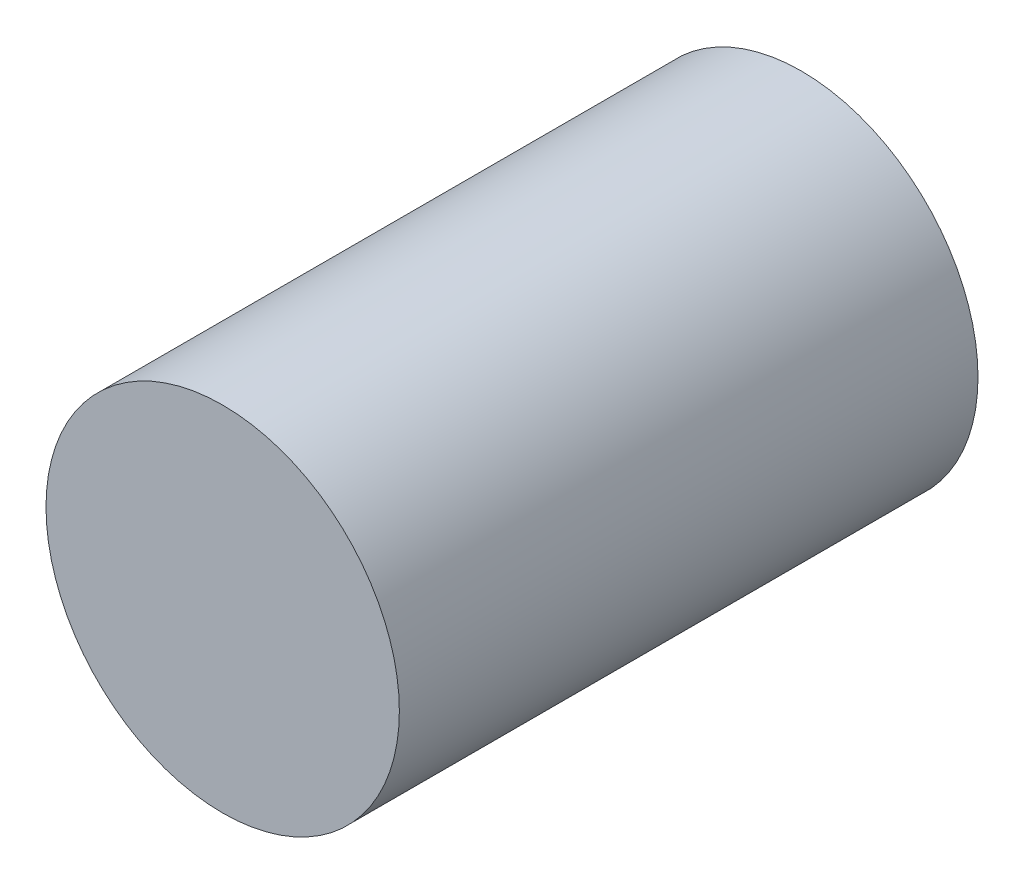
ISO-10303-21;
HEADER;
FILE_DESCRIPTION(('STEP AP214'),'2;1');
FILE_NAME('part.step','',(''),(''),'','','');
FILE_SCHEMA(('AUTOMOTIVE_DESIGN { 1 0 10303 214 1 1 1 1 }'));
ENDSEC;
DATA;
#1=APPLICATION_CONTEXT('core data for automotive mechanical design processes');
#2=APPLICATION_PROTOCOL_DEFINITION('international standard','automotive_design',2000,#1);
#3=PRODUCT_CONTEXT('',#1,'mechanical');
#4=PRODUCT('Part','Part','',(#3));
#5=PRODUCT_RELATED_PRODUCT_CATEGORY('part','',(#4));
#6=PRODUCT_DEFINITION_FORMATION('','',#4);
#7=PRODUCT_DEFINITION_CONTEXT('part definition',#1,'design');
#8=PRODUCT_DEFINITION('design','',#6,#7);
#9=PRODUCT_DEFINITION_SHAPE('','',#8);
#10=(LENGTH_UNIT() NAMED_UNIT(*) SI_UNIT(.MILLI.,.METRE.));
#11=(NAMED_UNIT(*) PLANE_ANGLE_UNIT() SI_UNIT($,.RADIAN.));
#12=(NAMED_UNIT(*) SI_UNIT($,.STERADIAN.) SOLID_ANGLE_UNIT());
#13=UNCERTAINTY_MEASURE_WITH_UNIT(LENGTH_MEASURE(1.E-05),#10,'distance_accuracy_value','');
#14=(GEOMETRIC_REPRESENTATION_CONTEXT(3) GLOBAL_UNCERTAINTY_ASSIGNED_CONTEXT((#13)) GLOBAL_UNIT_ASSIGNED_CONTEXT((#10,
#11,#12)) REPRESENTATION_CONTEXT('',''));
#15=CARTESIAN_POINT('',(0.,0.,0.));
#16=DIRECTION('',(0.,0.,1.));
#17=DIRECTION('',(1.,0.,0.));
#18=AXIS2_PLACEMENT_3D('',#15,#16,#17);
#19=CARTESIAN_POINT('',(0.,0.,0.));
#20=DIRECTION('',(0.,0.,1.));
#21=DIRECTION('',(1.,0.,0.));
#22=AXIS2_PLACEMENT_3D('',#19,#20,#21);
#23=PLANE('',#22);
#24=CARTESIAN_POINT('',(0.,0.,0.));
#25=DIRECTION('',(0.,0.,1.));
#26=DIRECTION('',(1.,0.,0.));
#27=AXIS2_PLACEMENT_3D('',#24,#25,#26);
#28=CIRCLE('',#27,4.);
#29=CARTESIAN_POINT('',(4.,0.,0.));
#30=VERTEX_POINT('',#29);
#31=EDGE_CURVE('E9',#30,#30,#28,.T.);
#32=ORIENTED_EDGE('',*,*,#31,.F.);
#33=EDGE_LOOP('',(#32));
#34=FACE_BOUND('',#33,.T.);
#35=ADVANCED_FACE('F15',(#34),#23,.F.);
#36=CARTESIAN_POINT('',(0.,0.,13.1));
#37=DIRECTION('',(0.,0.,1.));
#38=DIRECTION('',(1.,0.,0.));
#39=AXIS2_PLACEMENT_3D('',#36,#37,#38);
#40=PLANE('',#39);
#41=CARTESIAN_POINT('',(0.,0.,13.1));
#42=DIRECTION('',(0.,0.,1.));
#43=DIRECTION('',(1.,0.,0.));
#44=AXIS2_PLACEMENT_3D('',#41,#42,#43);
#45=CIRCLE('',#44,4.);
#46=CARTESIAN_POINT('',(4.,0.,13.1));
#47=VERTEX_POINT('',#46);
#48=EDGE_CURVE('E39',#47,#47,#45,.T.);
#49=ORIENTED_EDGE('',*,*,#48,.T.);
#50=EDGE_LOOP('',(#49));
#51=FACE_BOUND('',#50,.T.);
#52=ADVANCED_FACE('F45',(#51),#40,.T.);
#53=CARTESIAN_POINT('',(0.,0.,0.));
#54=DIRECTION('',(0.,0.,1.));
#55=DIRECTION('',(1.,0.,0.));
#56=AXIS2_PLACEMENT_3D('',#53,#54,#55);
#57=CYLINDRICAL_SURFACE('',#56,4.);
#58=ORIENTED_EDGE('',*,*,#48,.F.);
#59=DIRECTION('',(0.,0.,1.));
#60=VECTOR('',#59,1.);
#61=CARTESIAN_POINT('',(4.,0.,0.));
#62=LINE('',#61,#60);
#63=EDGE_CURVE('E23',#30,#47,#62,.T.);
#64=ORIENTED_EDGE('',*,*,#63,.F.);
#65=ORIENTED_EDGE('',*,*,#31,.T.);
#66=ORIENTED_EDGE('',*,*,#63,.T.);
#67=EDGE_LOOP('',(#58,#64,#65,#66));
#68=FACE_BOUND('',#67,.T.);
#69=ADVANCED_FACE('F36',(#68),#57,.T.);
#70=CLOSED_SHELL('',(#35,#52,#69));
#71=MANIFOLD_SOLID_BREP('B1',#70);
#72=ADVANCED_BREP_SHAPE_REPRESENTATION('',(#18,#71),#14);
#73=SHAPE_DEFINITION_REPRESENTATION(#9,#72);
ENDSEC;
END-ISO-10303-21;
